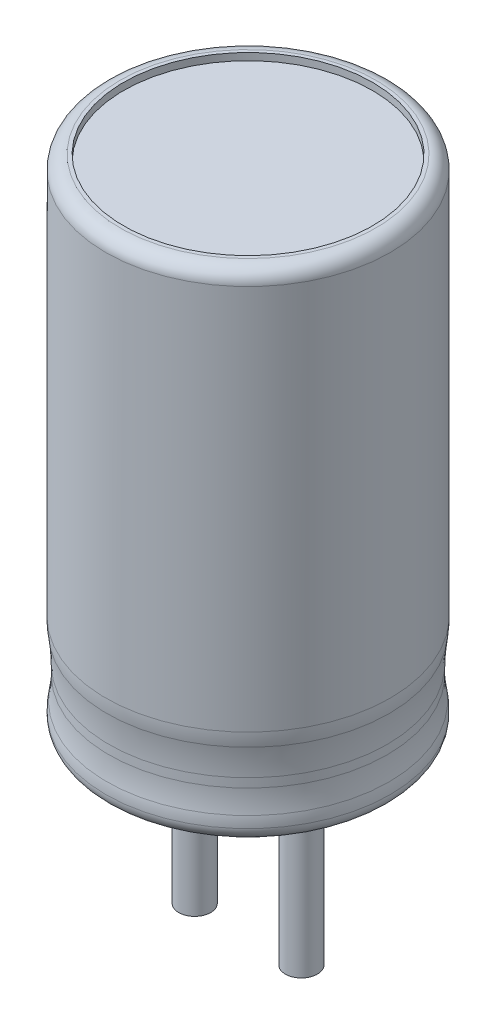
ISO-10303-21;
HEADER;
FILE_DESCRIPTION(('STEP AP214'),'2;1');
FILE_NAME('part.step','',(''),(''),'','','');
FILE_SCHEMA(('AUTOMOTIVE_DESIGN { 1 0 10303 214 1 1 1 1 }'));
ENDSEC;
DATA;
#1=APPLICATION_CONTEXT('core data for automotive mechanical design processes');
#2=APPLICATION_PROTOCOL_DEFINITION('international standard','automotive_design',2000,#1);
#3=PRODUCT_CONTEXT('',#1,'mechanical');
#4=PRODUCT('Part','Part','',(#3));
#5=PRODUCT_RELATED_PRODUCT_CATEGORY('part','',(#4));
#6=PRODUCT_DEFINITION_FORMATION('','',#4);
#7=PRODUCT_DEFINITION_CONTEXT('part definition',#1,'design');
#8=PRODUCT_DEFINITION('design','',#6,#7);
#9=PRODUCT_DEFINITION_SHAPE('','',#8);
#10=(LENGTH_UNIT() NAMED_UNIT(*) SI_UNIT(.MILLI.,.METRE.));
#11=(NAMED_UNIT(*) PLANE_ANGLE_UNIT() SI_UNIT($,.RADIAN.));
#12=(NAMED_UNIT(*) SI_UNIT($,.STERADIAN.) SOLID_ANGLE_UNIT());
#13=UNCERTAINTY_MEASURE_WITH_UNIT(LENGTH_MEASURE(1.E-05),#10,'distance_accuracy_value','');
#14=(GEOMETRIC_REPRESENTATION_CONTEXT(3) GLOBAL_UNCERTAINTY_ASSIGNED_CONTEXT((#13)) GLOBAL_UNIT_ASSIGNED_CONTEXT((#10,
#11,#12)) REPRESENTATION_CONTEXT('',''));
#15=CARTESIAN_POINT('',(0.,0.,0.));
#16=DIRECTION('',(0.,0.,1.));
#17=DIRECTION('',(1.,0.,0.));
#18=AXIS2_PLACEMENT_3D('',#15,#16,#17);
#19=CARTESIAN_POINT('',(0.,7.,0.));
#20=DIRECTION('',(0.,-1.,0.));
#21=DIRECTION('',(1.,0.,0.));
#22=AXIS2_PLACEMENT_3D('',#19,#20,#21);
#23=CYLINDRICAL_SURFACE('',#22,2.);
#24=CARTESIAN_POINT('',(0.,6.8,0.));
#25=DIRECTION('',(0.,1.,0.));
#26=DIRECTION('',(-1.,0.,0.));
#27=AXIS2_PLACEMENT_3D('',#24,#25,#26);
#28=CIRCLE('',#27,2.);
#29=CARTESIAN_POINT('',(-2.,6.8,0.));
#30=VERTEX_POINT('',#29);
#31=EDGE_CURVE('E53',#30,#30,#28,.F.);
#32=ORIENTED_EDGE('',*,*,#31,.T.);
#33=EDGE_LOOP('',(#32));
#34=FACE_BOUND('',#33,.T.);
#35=CARTESIAN_POINT('',(0.,1.37366973728438,0.));
#36=DIRECTION('',(0.,-1.,0.));
#37=DIRECTION('',(1.,0.,0.));
#38=AXIS2_PLACEMENT_3D('',#35,#36,#37);
#39=CIRCLE('',#38,2.);
#40=CARTESIAN_POINT('',(2.,1.37366973728438,0.));
#41=VERTEX_POINT('',#40);
#42=EDGE_CURVE('E71',#41,#41,#39,.T.);
#43=ORIENTED_EDGE('',*,*,#42,.F.);
#44=EDGE_LOOP('',(#43));
#45=FACE_BOUND('',#44,.T.);
#46=ADVANCED_FACE('F33',(#34,#45),#23,.T.);
#47=CARTESIAN_POINT('',(2.,7.,0.));
#48=DIRECTION('',(0.,1.,0.));
#49=DIRECTION('',(-1.,0.,0.));
#50=AXIS2_PLACEMENT_3D('',#47,#48,#49);
#51=PLANE('',#50);
#52=CARTESIAN_POINT('',(0.,7.,0.));
#53=DIRECTION('',(0.,1.,0.));
#54=DIRECTION('',(-1.,0.,0.));
#55=AXIS2_PLACEMENT_3D('',#52,#53,#54);
#56=CIRCLE('',#55,1.8);
#57=CARTESIAN_POINT('',(-1.8,7.,0.));
#58=VERTEX_POINT('',#57);
#59=EDGE_CURVE('E48',#58,#58,#56,.T.);
#60=ORIENTED_EDGE('',*,*,#59,.T.);
#61=EDGE_LOOP('',(#60));
#62=FACE_BOUND('',#61,.T.);
#63=CARTESIAN_POINT('',(0.,7.,0.));
#64=DIRECTION('',(0.,1.,0.));
#65=DIRECTION('',(0.,0.,-1.));
#66=AXIS2_PLACEMENT_3D('',#63,#64,#65);
#67=CIRCLE('',#66,1.75);
#68=CARTESIAN_POINT('',(0.,7.,-1.75));
#69=VERTEX_POINT('',#68);
#70=EDGE_CURVE('E75',#69,#69,#67,.T.);
#71=ORIENTED_EDGE('',*,*,#70,.F.);
#72=EDGE_LOOP('',(#71));
#73=FACE_BOUND('',#72,.T.);
#74=ADVANCED_FACE('F101',(#62,#73),#51,.T.);
#75=CARTESIAN_POINT('',(0.,0.,0.));
#76=DIRECTION('',(0.,-1.,0.));
#77=DIRECTION('',(1.,0.,0.));
#78=AXIS2_PLACEMENT_3D('',#75,#76,#77);
#79=PLANE('',#78);
#80=CARTESIAN_POINT('',(-0.75,0.,0.));
#81=DIRECTION('',(0.,-1.,0.));
#82=DIRECTION('',(1.,0.,0.));
#83=AXIS2_PLACEMENT_3D('',#80,#81,#82);
#84=CIRCLE('',#83,0.225);
#85=CARTESIAN_POINT('',(-0.525,0.,0.));
#86=VERTEX_POINT('',#85);
#87=EDGE_CURVE('E10',#86,#86,#84,.T.);
#88=ORIENTED_EDGE('',*,*,#87,.F.);
#89=EDGE_LOOP('',(#88));
#90=FACE_BOUND('',#89,.T.);
#91=CARTESIAN_POINT('',(0.,0.,0.));
#92=DIRECTION('',(0.,-1.,0.));
#93=DIRECTION('',(1.,0.,0.));
#94=AXIS2_PLACEMENT_3D('',#91,#92,#93);
#95=CIRCLE('',#94,1.79846160636851);
#96=CARTESIAN_POINT('',(1.79846160636851,0.,0.));
#97=VERTEX_POINT('',#96);
#98=EDGE_CURVE('E44',#97,#97,#95,.T.);
#99=ORIENTED_EDGE('',*,*,#98,.T.);
#100=EDGE_LOOP('',(#99));
#101=FACE_BOUND('',#100,.T.);
#102=CARTESIAN_POINT('',(0.75,0.,0.));
#103=DIRECTION('',(0.,-1.,0.));
#104=DIRECTION('',(1.,0.,0.));
#105=AXIS2_PLACEMENT_3D('',#102,#103,#104);
#106=CIRCLE('',#105,0.225);
#107=CARTESIAN_POINT('',(0.975,0.,0.));
#108=VERTEX_POINT('',#107);
#109=EDGE_CURVE('E56',#108,#108,#106,.T.);
#110=ORIENTED_EDGE('',*,*,#109,.F.);
#111=EDGE_LOOP('',(#110));
#112=FACE_BOUND('',#111,.T.);
#113=ADVANCED_FACE('F107',(#90,#101,#112),#79,.T.);
#114=CARTESIAN_POINT('',(0.,0.20720921399569,0.));
#115=DIRECTION('',(0.,-1.,0.));
#116=DIRECTION('',(1.,0.,0.));
#117=AXIS2_PLACEMENT_3D('',#114,#115,#116);
#118=TOROIDAL_SURFACE('',#117,1.22816707886081,0.770340092288513);
#119=CARTESIAN_POINT('',(0.,0.197471959592824,0.));
#120=DIRECTION('',(0.,1.,0.));
#121=DIRECTION('',(-1.,0.,0.));
#122=AXIS2_PLACEMENT_3D('',#119,#120,#121);
#123=CIRCLE('',#122,1.99844562825951);
#124=CARTESIAN_POINT('',(-1.99844562825951,0.197471959592824,0.));
#125=VERTEX_POINT('',#124);
#126=EDGE_CURVE('E40',#125,#125,#123,.T.);
#127=ORIENTED_EDGE('',*,*,#126,.T.);
#128=EDGE_LOOP('',(#127));
#129=FACE_BOUND('',#128,.T.);
#130=CARTESIAN_POINT('',(0.,0.34766167928665,0.));
#131=DIRECTION('',(0.,-1.,0.));
#132=DIRECTION('',(1.,0.,0.));
#133=AXIS2_PLACEMENT_3D('',#130,#131,#132);
#134=CIRCLE('',#133,1.98559493864731);
#135=CARTESIAN_POINT('',(1.98559493864731,0.34766167928665,0.));
#136=VERTEX_POINT('',#135);
#137=EDGE_CURVE('E59',#136,#136,#134,.T.);
#138=ORIENTED_EDGE('',*,*,#137,.T.);
#139=EDGE_LOOP('',(#138));
#140=FACE_BOUND('',#139,.T.);
#141=ADVANCED_FACE('F154',(#129,#140),#118,.T.);
#142=CARTESIAN_POINT('',(0.,0.661775925033597,0.));
#143=DIRECTION('',(0.,-1.,0.));
#144=DIRECTION('',(1.,0.,0.));
#145=AXIS2_PLACEMENT_3D('',#142,#143,#144);
#146=TOROIDAL_SURFACE('',#145,3.67954086114625,1.72282342325961);
#147=CARTESIAN_POINT('',(0.,0.661775925033597,0.));
#148=DIRECTION('',(0.,-1.,0.));
#149=DIRECTION('',(1.,0.,0.));
#150=AXIS2_PLACEMENT_3D('',#147,#148,#149);
#151=CIRCLE('',#150,1.95671743788664);
#152=CARTESIAN_POINT('',(1.95671743788664,0.661775925033597,0.));
#153=VERTEX_POINT('',#152);
#154=EDGE_CURVE('E62',#153,#153,#151,.T.);
#155=ORIENTED_EDGE('',*,*,#154,.T.);
#156=EDGE_LOOP('',(#155));
#157=FACE_BOUND('',#156,.T.);
#158=ORIENTED_EDGE('',*,*,#137,.F.);
#159=EDGE_LOOP('',(#158));
#160=FACE_BOUND('',#159,.T.);
#161=ADVANCED_FACE('F150',(#157,#160),#146,.F.);
#162=CARTESIAN_POINT('',(0.,7.,0.));
#163=DIRECTION('',(0.,-1.,0.));
#164=DIRECTION('',(1.,0.,0.));
#165=AXIS2_PLACEMENT_3D('',#162,#163,#164);
#166=CYLINDRICAL_SURFACE('',#165,1.95671743788664);
#167=CARTESIAN_POINT('',(0.,0.788075836154728,0.));
#168=DIRECTION('',(0.,-1.,0.));
#169=DIRECTION('',(1.,0.,0.));
#170=AXIS2_PLACEMENT_3D('',#167,#168,#169);
#171=CIRCLE('',#170,1.95671743788664);
#172=CARTESIAN_POINT('',(1.95671743788664,0.788075836154728,0.));
#173=VERTEX_POINT('',#172);
#174=EDGE_CURVE('E65',#173,#173,#171,.T.);
#175=ORIENTED_EDGE('',*,*,#174,.T.);
#176=EDGE_LOOP('',(#175));
#177=FACE_BOUND('',#176,.T.);
#178=ORIENTED_EDGE('',*,*,#154,.F.);
#179=EDGE_LOOP('',(#178));
#180=FACE_BOUND('',#179,.T.);
#181=ADVANCED_FACE('F146',(#177,#180),#166,.T.);
#182=CARTESIAN_POINT('',(0.,0.788075836154727,0.));
#183=DIRECTION('',(0.,-1.,0.));
#184=DIRECTION('',(1.,0.,0.));
#185=AXIS2_PLACEMENT_3D('',#182,#183,#184);
#186=TOROIDAL_SURFACE('',#185,4.61415383438802,2.65743639650137);
#187=CARTESIAN_POINT('',(0.,1.17877563532618,0.));
#188=DIRECTION('',(0.,-1.,0.));
#189=DIRECTION('',(1.,0.,0.));
#190=AXIS2_PLACEMENT_3D('',#187,#188,#189);
#191=CIRCLE('',#190,1.98559493864731);
#192=CARTESIAN_POINT('',(1.98559493864731,1.17877563532618,0.));
#193=VERTEX_POINT('',#192);
#194=EDGE_CURVE('E68',#193,#193,#191,.T.);
#195=ORIENTED_EDGE('',*,*,#194,.T.);
#196=EDGE_LOOP('',(#195));
#197=FACE_BOUND('',#196,.T.);
#198=ORIENTED_EDGE('',*,*,#174,.F.);
#199=EDGE_LOOP('',(#198));
#200=FACE_BOUND('',#199,.T.);
#201=ADVANCED_FACE('F138',(#197,#200),#186,.F.);
#202=CARTESIAN_POINT('',(0.,1.37366973728438,0.));
#203=DIRECTION('',(0.,-1.,0.));
#204=DIRECTION('',(1.,0.,0.));
#205=AXIS2_PLACEMENT_3D('',#202,#203,#204);
#206=DEGENERATE_TOROIDAL_SURFACE('',#205,0.674382016306358,1.32561798369364,.T.);
#207=ORIENTED_EDGE('',*,*,#42,.T.);
#208=EDGE_LOOP('',(#207));
#209=FACE_BOUND('',#208,.T.);
#210=ORIENTED_EDGE('',*,*,#194,.F.);
#211=EDGE_LOOP('',(#210));
#212=FACE_BOUND('',#211,.T.);
#213=ADVANCED_FACE('F129',(#209,#212),#206,.T.);
#214=CARTESIAN_POINT('',(0.,6.9,0.));
#215=DIRECTION('',(0.,1.,0.));
#216=DIRECTION('',(0.,0.,1.));
#217=AXIS2_PLACEMENT_3D('',#214,#215,#216);
#218=CYLINDRICAL_SURFACE('',#217,1.75);
#219=CARTESIAN_POINT('',(0.,6.9,0.));
#220=DIRECTION('',(0.,1.,0.));
#221=DIRECTION('',(0.,0.,-1.));
#222=AXIS2_PLACEMENT_3D('',#219,#220,#221);
#223=CIRCLE('',#222,1.75);
#224=CARTESIAN_POINT('',(0.,6.9,-1.75));
#225=VERTEX_POINT('',#224);
#226=EDGE_CURVE('E74',#225,#225,#223,.T.);
#227=ORIENTED_EDGE('',*,*,#226,.F.);
#228=EDGE_LOOP('',(#227));
#229=FACE_BOUND('',#228,.T.);
#230=ORIENTED_EDGE('',*,*,#70,.T.);
#231=EDGE_LOOP('',(#230));
#232=FACE_BOUND('',#231,.T.);
#233=ADVANCED_FACE('F126',(#229,#232),#218,.F.);
#234=CARTESIAN_POINT('',(0.,6.9,0.));
#235=DIRECTION('',(0.,-1.,0.));
#236=DIRECTION('',(0.,0.,-1.));
#237=AXIS2_PLACEMENT_3D('',#234,#235,#236);
#238=PLANE('',#237);
#239=ORIENTED_EDGE('',*,*,#226,.T.);
#240=EDGE_LOOP('',(#239));
#241=FACE_BOUND('',#240,.T.);
#242=ADVANCED_FACE('F128',(#241),#238,.F.);
#243=CARTESIAN_POINT('',(0.75,-2.5,0.));
#244=DIRECTION('',(0.,1.,0.));
#245=DIRECTION('',(0.,0.,1.));
#246=AXIS2_PLACEMENT_3D('',#243,#244,#245);
#247=CYLINDRICAL_SURFACE('',#246,0.225);
#248=CARTESIAN_POINT('',(0.75,-2.5,0.));
#249=DIRECTION('',(0.,1.,0.));
#250=DIRECTION('',(0.,0.,1.));
#251=AXIS2_PLACEMENT_3D('',#248,#249,#250);
#252=CIRCLE('',#251,0.225);
#253=CARTESIAN_POINT('',(0.75,-2.5,0.225));
#254=VERTEX_POINT('',#253);
#255=EDGE_CURVE('E78',#254,#254,#252,.T.);
#256=ORIENTED_EDGE('',*,*,#255,.T.);
#257=EDGE_LOOP('',(#256));
#258=FACE_BOUND('',#257,.T.);
#259=ORIENTED_EDGE('',*,*,#109,.T.);
#260=EDGE_LOOP('',(#259));
#261=FACE_BOUND('',#260,.T.);
#262=ADVANCED_FACE('F118',(#258,#261),#247,.T.);
#263=CARTESIAN_POINT('',(0.975,-2.5,0.));
#264=DIRECTION('',(0.,-1.,0.));
#265=DIRECTION('',(0.,0.,-1.));
#266=AXIS2_PLACEMENT_3D('',#263,#264,#265);
#267=PLANE('',#266);
#268=ORIENTED_EDGE('',*,*,#255,.F.);
#269=EDGE_LOOP('',(#268));
#270=FACE_BOUND('',#269,.T.);
#271=ADVANCED_FACE('F113',(#270),#267,.T.);
#272=CARTESIAN_POINT('',(0.,6.8,0.));
#273=DIRECTION('',(0.,1.,0.));
#274=DIRECTION('',(-1.,0.,0.));
#275=AXIS2_PLACEMENT_3D('',#272,#273,#274);
#276=TOROIDAL_SURFACE('',#275,1.8,0.2);
#277=ORIENTED_EDGE('',*,*,#59,.F.);
#278=EDGE_LOOP('',(#277));
#279=FACE_BOUND('',#278,.T.);
#280=ORIENTED_EDGE('',*,*,#31,.F.);
#281=EDGE_LOOP('',(#280));
#282=FACE_BOUND('',#281,.T.);
#283=ADVANCED_FACE('F97',(#279,#282),#276,.T.);
#284=CARTESIAN_POINT('',(0.,0.2,0.));
#285=DIRECTION('',(0.,-1.,0.));
#286=DIRECTION('',(1.,0.,0.));
#287=AXIS2_PLACEMENT_3D('',#284,#285,#286);
#288=TOROIDAL_SURFACE('',#287,1.79846160636851,0.2);
#289=ORIENTED_EDGE('',*,*,#126,.F.);
#290=EDGE_LOOP('',(#289));
#291=FACE_BOUND('',#290,.T.);
#292=ORIENTED_EDGE('',*,*,#98,.F.);
#293=EDGE_LOOP('',(#292));
#294=FACE_BOUND('',#293,.T.);
#295=ADVANCED_FACE('F35',(#291,#294),#288,.T.);
#296=CARTESIAN_POINT('',(-0.75,-2.5,0.));
#297=DIRECTION('',(0.,1.,0.));
#298=DIRECTION('',(0.,0.,1.));
#299=AXIS2_PLACEMENT_3D('',#296,#297,#298);
#300=CYLINDRICAL_SURFACE('',#299,0.225);
#301=CARTESIAN_POINT('',(-0.75,-2.5,0.));
#302=DIRECTION('',(0.,-1.,0.));
#303=DIRECTION('',(0.,0.,1.));
#304=AXIS2_PLACEMENT_3D('',#301,#302,#303);
#305=CIRCLE('',#304,0.225);
#306=CARTESIAN_POINT('',(-0.75,-2.5,0.225));
#307=VERTEX_POINT('',#306);
#308=EDGE_CURVE('E83',#307,#307,#305,.T.);
#309=ORIENTED_EDGE('',*,*,#308,.F.);
#310=EDGE_LOOP('',(#309));
#311=FACE_BOUND('',#310,.T.);
#312=ORIENTED_EDGE('',*,*,#87,.T.);
#313=EDGE_LOOP('',(#312));
#314=FACE_BOUND('',#313,.T.);
#315=ADVANCED_FACE('F89',(#311,#314),#300,.T.);
#316=CARTESIAN_POINT('',(-0.975,-2.5,0.));
#317=DIRECTION('',(0.,-1.,0.));
#318=DIRECTION('',(0.,0.,-1.));
#319=AXIS2_PLACEMENT_3D('',#316,#317,#318);
#320=PLANE('',#319);
#321=ORIENTED_EDGE('',*,*,#308,.T.);
#322=EDGE_LOOP('',(#321));
#323=FACE_BOUND('',#322,.T.);
#324=ADVANCED_FACE('F87',(#323),#320,.T.);
#325=CLOSED_SHELL('',(#46,#74,#113,#141,#161,#181,#201,#213,#233,#242,#262,#271,#283,#295,#315,#324));
#326=MANIFOLD_SOLID_BREP('B2',#325);
#327=ADVANCED_BREP_SHAPE_REPRESENTATION('',(#18,#326),#14);
#328=SHAPE_DEFINITION_REPRESENTATION(#9,#327);
ENDSEC;
END-ISO-10303-21;
